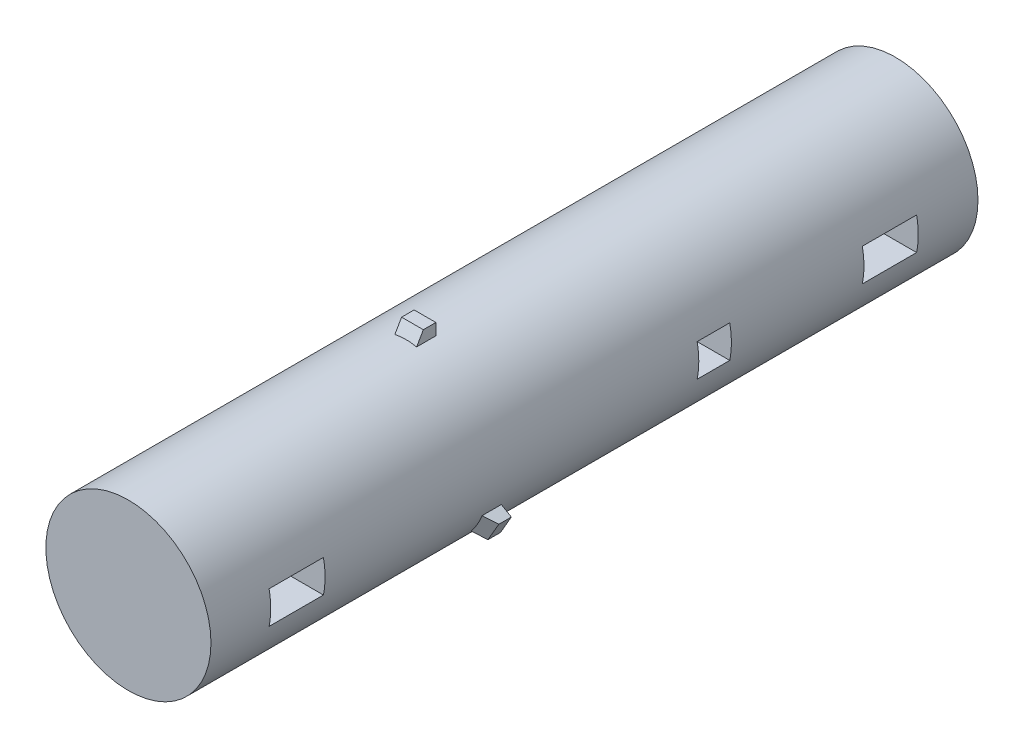
ISO-10303-21;
HEADER;
FILE_DESCRIPTION(('STEP AP214'),'2;1');
FILE_NAME('part.step','',(''),(''),'','','');
FILE_SCHEMA(('AUTOMOTIVE_DESIGN { 1 0 10303 214 1 1 1 1 }'));
ENDSEC;
DATA;
#1=APPLICATION_CONTEXT('core data for automotive mechanical design processes');
#2=APPLICATION_PROTOCOL_DEFINITION('international standard','automotive_design',2000,#1);
#3=PRODUCT_CONTEXT('',#1,'mechanical');
#4=PRODUCT('Part','Part','',(#3));
#5=PRODUCT_RELATED_PRODUCT_CATEGORY('part','',(#4));
#6=PRODUCT_DEFINITION_FORMATION('','',#4);
#7=PRODUCT_DEFINITION_CONTEXT('part definition',#1,'design');
#8=PRODUCT_DEFINITION('design','',#6,#7);
#9=PRODUCT_DEFINITION_SHAPE('','',#8);
#10=(LENGTH_UNIT() NAMED_UNIT(*) SI_UNIT(.MILLI.,.METRE.));
#11=(NAMED_UNIT(*) PLANE_ANGLE_UNIT() SI_UNIT($,.RADIAN.));
#12=(NAMED_UNIT(*) SI_UNIT($,.STERADIAN.) SOLID_ANGLE_UNIT());
#13=UNCERTAINTY_MEASURE_WITH_UNIT(LENGTH_MEASURE(1.E-05),#10,'distance_accuracy_value','');
#14=(GEOMETRIC_REPRESENTATION_CONTEXT(3) GLOBAL_UNCERTAINTY_ASSIGNED_CONTEXT((#13)) GLOBAL_UNIT_ASSIGNED_CONTEXT((#10,
#11,#12)) REPRESENTATION_CONTEXT('',''));
#15=CARTESIAN_POINT('',(0.,0.,0.));
#16=DIRECTION('',(0.,0.,1.));
#17=DIRECTION('',(1.,0.,0.));
#18=AXIS2_PLACEMENT_3D('',#15,#16,#17);
#19=CARTESIAN_POINT('',(0.,0.,35.3));
#20=DIRECTION('',(0.,0.,-1.));
#21=DIRECTION('',(-1.,0.,0.));
#22=AXIS2_PLACEMENT_3D('',#19,#20,#21);
#23=CYLINDRICAL_SURFACE('',#22,3.8);
#24=CARTESIAN_POINT('',(0.,0.,21.65));
#25=DIRECTION('',(0.,0.,1.));
#26=DIRECTION('',(1.,0.,0.));
#27=AXIS2_PLACEMENT_3D('',#24,#25,#26);
#28=CIRCLE('',#27,3.8);
#29=CARTESIAN_POINT('',(-3.51228447563974,-1.45046811829148,21.65));
#30=VERTEX_POINT('',#29);
#31=CARTESIAN_POINT('',(-3.01228447563975,-2.31649352207593,21.65));
#32=VERTEX_POINT('',#31);
#33=EDGE_CURVE('E46',#30,#32,#28,.T.);
#34=ORIENTED_EDGE('',*,*,#33,.F.);
#35=DIRECTION('',(0.,0.,-1.));
#36=VECTOR('',#35,1.);
#37=CARTESIAN_POINT('',(-3.51228447563974,-1.45046811829148,35.3));
#38=LINE('',#37,#36);
#39=CARTESIAN_POINT('',(-3.51228447563974,-1.45046811829148,22.5351001096119));
#40=VERTEX_POINT('',#39);
#41=EDGE_CURVE('E11',#30,#40,#38,.F.);
#42=ORIENTED_EDGE('',*,*,#41,.T.);
#43=CARTESIAN_POINT('',(0.,0.,24.709956426705));
#44=DIRECTION('',(-0.43301270189222,-0.249999999999995,0.86602540378444));
#45=DIRECTION('',(-0.750000000000005,-0.433012701892213,-0.499999999999998));
#46=AXIS2_PLACEMENT_3D('',#43,#44,#45);
#47=ELLIPSE('',#46,4.38786204584115,3.8);
#48=CARTESIAN_POINT('',(-3.01228447563975,-2.31649352207593,22.5351001096119));
#49=VERTEX_POINT('',#48);
#50=EDGE_CURVE('E383',#40,#49,#47,.T.);
#51=ORIENTED_EDGE('',*,*,#50,.T.);
#52=DIRECTION('',(0.,0.,-1.));
#53=VECTOR('',#52,1.);
#54=CARTESIAN_POINT('',(-3.01228447563975,-2.31649352207593,35.3));
#55=LINE('',#54,#53);
#56=EDGE_CURVE('E380',#32,#49,#55,.F.);
#57=ORIENTED_EDGE('',*,*,#56,.F.);
#58=EDGE_LOOP('',(#34,#42,#51,#57));
#59=FACE_BOUND('',#58,.T.);
#60=CARTESIAN_POINT('',(0.,0.,21.65));
#61=DIRECTION('',(0.,0.,1.));
#62=DIRECTION('',(1.,0.,0.));
#63=AXIS2_PLACEMENT_3D('',#60,#61,#62);
#64=CIRCLE('',#63,3.8);
#65=CARTESIAN_POINT('',(3.01228447563972,-2.31649352207597,21.65));
#66=VERTEX_POINT('',#65);
#67=CARTESIAN_POINT('',(3.51228447563973,-1.45046811829153,21.65));
#68=VERTEX_POINT('',#67);
#69=EDGE_CURVE('E375',#66,#68,#64,.T.);
#70=ORIENTED_EDGE('',*,*,#69,.F.);
#71=DIRECTION('',(0.,0.,-1.));
#72=VECTOR('',#71,1.);
#73=CARTESIAN_POINT('',(3.01228447563972,-2.31649352207597,35.3));
#74=LINE('',#73,#72);
#75=CARTESIAN_POINT('',(3.01228447563971,-2.31649352207596,22.5351001096119));
#76=VERTEX_POINT('',#75);
#77=EDGE_CURVE('E378',#66,#76,#74,.F.);
#78=ORIENTED_EDGE('',*,*,#77,.T.);
#79=CARTESIAN_POINT('',(0.,0.,24.709956426705));
#80=DIRECTION('',(0.433012701892216,-0.250000000000001,0.86602540378444));
#81=DIRECTION('',(0.749999999999999,-0.433012701892223,-0.499999999999998));
#82=AXIS2_PLACEMENT_3D('',#79,#80,#81);
#83=ELLIPSE('',#82,4.38786204584115,3.8);
#84=CARTESIAN_POINT('',(3.51228447563972,-1.45046811829153,22.5351001096119));
#85=VERTEX_POINT('',#84);
#86=EDGE_CURVE('E373',#76,#85,#83,.T.);
#87=ORIENTED_EDGE('',*,*,#86,.T.);
#88=DIRECTION('',(0.,0.,-1.));
#89=VECTOR('',#88,1.);
#90=CARTESIAN_POINT('',(3.51228447563973,-1.45046811829153,35.3));
#91=LINE('',#90,#89);
#92=EDGE_CURVE('E370',#68,#85,#91,.F.);
#93=ORIENTED_EDGE('',*,*,#92,.F.);
#94=EDGE_LOOP('',(#70,#78,#87,#93));
#95=FACE_BOUND('',#94,.T.);
#96=CARTESIAN_POINT('',(0.,0.,21.65));
#97=DIRECTION('',(0.,0.,1.));
#98=DIRECTION('',(1.,0.,0.));
#99=AXIS2_PLACEMENT_3D('',#96,#97,#98);
#100=CIRCLE('',#99,3.8);
#101=CARTESIAN_POINT('',(0.5,3.76696164036747,21.65));
#102=VERTEX_POINT('',#101);
#103=CARTESIAN_POINT('',(-0.5,3.76696164036747,21.65));
#104=VERTEX_POINT('',#103);
#105=EDGE_CURVE('E365',#102,#104,#100,.T.);
#106=ORIENTED_EDGE('',*,*,#105,.F.);
#107=DIRECTION('',(0.,0.,-1.));
#108=VECTOR('',#107,1.);
#109=CARTESIAN_POINT('',(0.5,3.76696164036747,35.3));
#110=LINE('',#109,#108);
#111=CARTESIAN_POINT('',(0.5,3.76696164036747,22.5351001096119));
#112=VERTEX_POINT('',#111);
#113=EDGE_CURVE('E368',#102,#112,#110,.F.);
#114=ORIENTED_EDGE('',*,*,#113,.T.);
#115=CARTESIAN_POINT('',(0.,0.,24.709956426705));
#116=DIRECTION('',(0.,0.499999999999998,0.86602540378444));
#117=DIRECTION('',(0.,0.86602540378444,-0.499999999999998));
#118=AXIS2_PLACEMENT_3D('',#115,#116,#117);
#119=ELLIPSE('',#118,4.38786204584115,3.8);
#120=CARTESIAN_POINT('',(-0.5,3.76696164036747,22.5351001096119));
#121=VERTEX_POINT('',#120);
#122=EDGE_CURVE('E363',#112,#121,#119,.T.);
#123=ORIENTED_EDGE('',*,*,#122,.T.);
#124=DIRECTION('',(0.,0.,-1.));
#125=VECTOR('',#124,1.);
#126=CARTESIAN_POINT('',(-0.5,3.76696164036747,35.3));
#127=LINE('',#126,#125);
#128=EDGE_CURVE('E360',#104,#121,#127,.F.);
#129=ORIENTED_EDGE('',*,*,#128,.F.);
#130=EDGE_LOOP('',(#106,#114,#123,#129));
#131=FACE_BOUND('',#130,.T.);
#132=CARTESIAN_POINT('',(0.,0.,12.85));
#133=DIRECTION('',(0.,0.,-1.));
#134=DIRECTION('',(-1.,0.,0.));
#135=AXIS2_PLACEMENT_3D('',#132,#133,#134);
#136=CIRCLE('',#135,3.8);
#137=CARTESIAN_POINT('',(3.72525166935068,0.75,12.85));
#138=VERTEX_POINT('',#137);
#139=CARTESIAN_POINT('',(3.72525166935068,-0.75,12.85));
#140=VERTEX_POINT('',#139);
#141=EDGE_CURVE('E344',#138,#140,#136,.T.);
#142=ORIENTED_EDGE('',*,*,#141,.F.);
#143=DIRECTION('',(0.,0.,-1.));
#144=VECTOR('',#143,1.);
#145=CARTESIAN_POINT('',(3.72525166935068,0.75,35.3));
#146=LINE('',#145,#144);
#147=CARTESIAN_POINT('',(3.72525166935068,0.75,11.35));
#148=VERTEX_POINT('',#147);
#149=EDGE_CURVE('E354',#148,#138,#146,.F.);
#150=ORIENTED_EDGE('',*,*,#149,.F.);
#151=CARTESIAN_POINT('',(0.,0.,11.35));
#152=DIRECTION('',(0.,0.,-1.));
#153=DIRECTION('',(-1.,0.,0.));
#154=AXIS2_PLACEMENT_3D('',#151,#152,#153);
#155=CIRCLE('',#154,3.8);
#156=CARTESIAN_POINT('',(3.72525166935068,-0.75,11.35));
#157=VERTEX_POINT('',#156);
#158=EDGE_CURVE('E341',#148,#157,#155,.T.);
#159=ORIENTED_EDGE('',*,*,#158,.T.);
#160=DIRECTION('',(0.,0.,-1.));
#161=VECTOR('',#160,1.);
#162=CARTESIAN_POINT('',(3.72525166935068,-0.75,35.3));
#163=LINE('',#162,#161);
#164=EDGE_CURVE('E347',#157,#140,#163,.F.);
#165=ORIENTED_EDGE('',*,*,#164,.T.);
#166=EDGE_LOOP('',(#142,#150,#159,#165));
#167=FACE_BOUND('',#166,.T.);
#168=CARTESIAN_POINT('',(0.,0.,5.25));
#169=DIRECTION('',(0.,0.,-1.));
#170=DIRECTION('',(-1.,0.,0.));
#171=AXIS2_PLACEMENT_3D('',#168,#169,#170);
#172=CIRCLE('',#171,3.8);
#173=CARTESIAN_POINT('',(3.72525166935068,0.75,5.25));
#174=VERTEX_POINT('',#173);
#175=CARTESIAN_POINT('',(3.72525166935068,-0.75,5.25));
#176=VERTEX_POINT('',#175);
#177=EDGE_CURVE('E326',#174,#176,#172,.T.);
#178=ORIENTED_EDGE('',*,*,#177,.F.);
#179=DIRECTION('',(0.,0.,-1.));
#180=VECTOR('',#179,1.);
#181=CARTESIAN_POINT('',(3.72525166935068,0.75,35.3));
#182=LINE('',#181,#180);
#183=CARTESIAN_POINT('',(3.72525166935068,0.75,2.75));
#184=VERTEX_POINT('',#183);
#185=EDGE_CURVE('E335',#174,#184,#182,.T.);
#186=ORIENTED_EDGE('',*,*,#185,.T.);
#187=CARTESIAN_POINT('',(0.,0.,2.75));
#188=DIRECTION('',(0.,0.,-1.));
#189=DIRECTION('',(-1.,0.,0.));
#190=AXIS2_PLACEMENT_3D('',#187,#188,#189);
#191=CIRCLE('',#190,3.8);
#192=CARTESIAN_POINT('',(3.72525166935068,-0.75,2.75));
#193=VERTEX_POINT('',#192);
#194=EDGE_CURVE('E323',#184,#193,#191,.T.);
#195=ORIENTED_EDGE('',*,*,#194,.T.);
#196=DIRECTION('',(0.,0.,-1.));
#197=VECTOR('',#196,1.);
#198=CARTESIAN_POINT('',(3.72525166935068,-0.75,35.3));
#199=LINE('',#198,#197);
#200=EDGE_CURVE('E329',#176,#193,#199,.T.);
#201=ORIENTED_EDGE('',*,*,#200,.F.);
#202=EDGE_LOOP('',(#178,#186,#195,#201));
#203=FACE_BOUND('',#202,.T.);
#204=CARTESIAN_POINT('',(0.,0.,32.55));
#205=DIRECTION('',(0.,0.,-1.));
#206=DIRECTION('',(-1.,0.,0.));
#207=AXIS2_PLACEMENT_3D('',#204,#205,#206);
#208=CIRCLE('',#207,3.8);
#209=CARTESIAN_POINT('',(3.72525166935068,0.75,32.55));
#210=VERTEX_POINT('',#209);
#211=CARTESIAN_POINT('',(3.72525166935068,-0.75,32.55));
#212=VERTEX_POINT('',#211);
#213=EDGE_CURVE('E307',#210,#212,#208,.T.);
#214=ORIENTED_EDGE('',*,*,#213,.F.);
#215=DIRECTION('',(0.,0.,-1.));
#216=VECTOR('',#215,1.);
#217=CARTESIAN_POINT('',(3.72525166935068,0.75,35.3));
#218=LINE('',#217,#216);
#219=CARTESIAN_POINT('',(3.72525166935068,0.75,30.05));
#220=VERTEX_POINT('',#219);
#221=EDGE_CURVE('E317',#220,#210,#218,.F.);
#222=ORIENTED_EDGE('',*,*,#221,.F.);
#223=CARTESIAN_POINT('',(0.,0.,30.05));
#224=DIRECTION('',(0.,0.,-1.));
#225=DIRECTION('',(-1.,0.,0.));
#226=AXIS2_PLACEMENT_3D('',#223,#224,#225);
#227=CIRCLE('',#226,3.8);
#228=CARTESIAN_POINT('',(3.72525166935068,-0.75,30.05));
#229=VERTEX_POINT('',#228);
#230=EDGE_CURVE('E302',#220,#229,#227,.T.);
#231=ORIENTED_EDGE('',*,*,#230,.T.);
#232=DIRECTION('',(0.,0.,-1.));
#233=VECTOR('',#232,1.);
#234=CARTESIAN_POINT('',(3.72525166935068,-0.75,35.3));
#235=LINE('',#234,#233);
#236=EDGE_CURVE('E310',#229,#212,#235,.F.);
#237=ORIENTED_EDGE('',*,*,#236,.T.);
#238=EDGE_LOOP('',(#214,#222,#231,#237));
#239=FACE_BOUND('',#238,.T.);
#240=CARTESIAN_POINT('',(0.,0.,35.3));
#241=DIRECTION('',(0.,0.,1.));
#242=DIRECTION('',(1.,0.,0.));
#243=AXIS2_PLACEMENT_3D('',#240,#241,#242);
#244=CIRCLE('',#243,3.8);
#245=CARTESIAN_POINT('',(3.8,0.,35.3));
#246=VERTEX_POINT('',#245);
#247=EDGE_CURVE('E299',#246,#246,#244,.T.);
#248=ORIENTED_EDGE('',*,*,#247,.F.);
#249=EDGE_LOOP('',(#248));
#250=FACE_BOUND('',#249,.T.);
#251=CARTESIAN_POINT('',(0.,0.,0.));
#252=DIRECTION('',(0.,0.,1.));
#253=DIRECTION('',(1.,0.,0.));
#254=AXIS2_PLACEMENT_3D('',#251,#252,#253);
#255=CIRCLE('',#254,3.8);
#256=CARTESIAN_POINT('',(3.8,0.,0.));
#257=VERTEX_POINT('',#256);
#258=EDGE_CURVE('E291',#257,#257,#255,.T.);
#259=ORIENTED_EDGE('',*,*,#258,.T.);
#260=EDGE_LOOP('',(#259));
#261=FACE_BOUND('',#260,.T.);
#262=DIRECTION('',(0.,0.,-1.));
#263=VECTOR('',#262,1.);
#264=CARTESIAN_POINT('',(-3.72525166935068,0.75,35.3));
#265=LINE('',#264,#263);
#266=CARTESIAN_POINT('',(-3.72525166935068,0.75,32.55));
#267=VERTEX_POINT('',#266);
#268=CARTESIAN_POINT('',(-3.72525166935068,0.75,30.05));
#269=VERTEX_POINT('',#268);
#270=EDGE_CURVE('E320',#267,#269,#265,.T.);
#271=ORIENTED_EDGE('',*,*,#270,.F.);
#272=CARTESIAN_POINT('',(-3.72525166935068,-0.75,32.55));
#273=VERTEX_POINT('',#272);
#274=EDGE_CURVE('E311',#273,#267,#208,.T.);
#275=ORIENTED_EDGE('',*,*,#274,.F.);
#276=DIRECTION('',(0.,0.,-1.));
#277=VECTOR('',#276,1.);
#278=CARTESIAN_POINT('',(-3.72525166935068,-0.75,35.3));
#279=LINE('',#278,#277);
#280=CARTESIAN_POINT('',(-3.72525166935068,-0.75,30.05));
#281=VERTEX_POINT('',#280);
#282=EDGE_CURVE('E314',#273,#281,#279,.T.);
#283=ORIENTED_EDGE('',*,*,#282,.T.);
#284=EDGE_CURVE('E308',#281,#269,#227,.T.);
#285=ORIENTED_EDGE('',*,*,#284,.T.);
#286=EDGE_LOOP('',(#271,#275,#283,#285));
#287=FACE_BOUND('',#286,.T.);
#288=DIRECTION('',(0.,0.,-1.));
#289=VECTOR('',#288,1.);
#290=CARTESIAN_POINT('',(-3.72525166935068,0.75,35.3));
#291=LINE('',#290,#289);
#292=CARTESIAN_POINT('',(-3.72525166935068,0.75,2.75));
#293=VERTEX_POINT('',#292);
#294=CARTESIAN_POINT('',(-3.72525166935068,0.75,5.25));
#295=VERTEX_POINT('',#294);
#296=EDGE_CURVE('E338',#293,#295,#291,.F.);
#297=ORIENTED_EDGE('',*,*,#296,.T.);
#298=CARTESIAN_POINT('',(-3.72525166935068,-0.75,5.25));
#299=VERTEX_POINT('',#298);
#300=EDGE_CURVE('E330',#299,#295,#172,.T.);
#301=ORIENTED_EDGE('',*,*,#300,.F.);
#302=DIRECTION('',(0.,0.,-1.));
#303=VECTOR('',#302,1.);
#304=CARTESIAN_POINT('',(-3.72525166935068,-0.75,35.3));
#305=LINE('',#304,#303);
#306=CARTESIAN_POINT('',(-3.72525166935068,-0.75,2.75));
#307=VERTEX_POINT('',#306);
#308=EDGE_CURVE('E333',#307,#299,#305,.F.);
#309=ORIENTED_EDGE('',*,*,#308,.F.);
#310=EDGE_CURVE('E327',#307,#293,#191,.T.);
#311=ORIENTED_EDGE('',*,*,#310,.T.);
#312=EDGE_LOOP('',(#297,#301,#309,#311));
#313=FACE_BOUND('',#312,.T.);
#314=DIRECTION('',(0.,0.,-1.));
#315=VECTOR('',#314,1.);
#316=CARTESIAN_POINT('',(-3.72525166935068,0.75,35.3));
#317=LINE('',#316,#315);
#318=CARTESIAN_POINT('',(-3.72525166935068,0.75,12.85));
#319=VERTEX_POINT('',#318);
#320=CARTESIAN_POINT('',(-3.72525166935068,0.75,11.35));
#321=VERTEX_POINT('',#320);
#322=EDGE_CURVE('E357',#319,#321,#317,.T.);
#323=ORIENTED_EDGE('',*,*,#322,.F.);
#324=CARTESIAN_POINT('',(-3.72525166935068,-0.75,12.85));
#325=VERTEX_POINT('',#324);
#326=EDGE_CURVE('E348',#325,#319,#136,.T.);
#327=ORIENTED_EDGE('',*,*,#326,.F.);
#328=DIRECTION('',(0.,0.,-1.));
#329=VECTOR('',#328,1.);
#330=CARTESIAN_POINT('',(-3.72525166935068,-0.75,35.3));
#331=LINE('',#330,#329);
#332=CARTESIAN_POINT('',(-3.72525166935068,-0.75,11.35));
#333=VERTEX_POINT('',#332);
#334=EDGE_CURVE('E351',#325,#333,#331,.T.);
#335=ORIENTED_EDGE('',*,*,#334,.T.);
#336=EDGE_CURVE('E345',#333,#321,#155,.T.);
#337=ORIENTED_EDGE('',*,*,#336,.T.);
#338=EDGE_LOOP('',(#323,#327,#335,#337));
#339=FACE_BOUND('',#338,.T.);
#340=ADVANCED_FACE('F39',(#59,#95,#131,#167,#203,#239,#250,#261,#287,#313,#339),#23,.T.);
#341=CARTESIAN_POINT('',(0.,0.,35.3));
#342=DIRECTION('',(0.,0.,1.));
#343=DIRECTION('',(1.,0.,0.));
#344=AXIS2_PLACEMENT_3D('',#341,#342,#343);
#345=PLANE('',#344);
#346=ORIENTED_EDGE('',*,*,#247,.T.);
#347=EDGE_LOOP('',(#346));
#348=FACE_BOUND('',#347,.T.);
#349=ADVANCED_FACE('F391',(#348),#345,.T.);
#350=CARTESIAN_POINT('',(0.,0.,0.));
#351=DIRECTION('',(0.,0.,1.));
#352=DIRECTION('',(1.,0.,0.));
#353=AXIS2_PLACEMENT_3D('',#350,#351,#352);
#354=PLANE('',#353);
#355=ORIENTED_EDGE('',*,*,#258,.F.);
#356=EDGE_LOOP('',(#355));
#357=FACE_BOUND('',#356,.T.);
#358=ADVANCED_FACE('F468',(#357),#354,.F.);
#359=CARTESIAN_POINT('',(-3.8,-0.75,0.));
#360=DIRECTION('',(0.,-1.,0.));
#361=DIRECTION('',(0.,0.,-1.));
#362=AXIS2_PLACEMENT_3D('',#359,#360,#361);
#363=PLANE('',#362);
#364=DIRECTION('',(1.,0.,0.));
#365=VECTOR('',#364,1.);
#366=CARTESIAN_POINT('',(-3.8,-0.75,32.55));
#367=LINE('',#366,#365);
#368=EDGE_CURVE('E288',#273,#212,#367,.T.);
#369=ORIENTED_EDGE('',*,*,#368,.T.);
#370=ORIENTED_EDGE('',*,*,#236,.F.);
#371=DIRECTION('',(1.,0.,0.));
#372=VECTOR('',#371,1.);
#373=CARTESIAN_POINT('',(-3.8,-0.75,30.05));
#374=LINE('',#373,#372);
#375=EDGE_CURVE('E280',#281,#229,#374,.T.);
#376=ORIENTED_EDGE('',*,*,#375,.F.);
#377=ORIENTED_EDGE('',*,*,#282,.F.);
#378=EDGE_LOOP('',(#369,#370,#376,#377));
#379=FACE_BOUND('',#378,.T.);
#380=ADVANCED_FACE('F458',(#379),#363,.F.);
#381=CARTESIAN_POINT('',(-3.8,0.,32.55));
#382=DIRECTION('',(0.,0.,-1.));
#383=DIRECTION('',(-1.,0.,0.));
#384=AXIS2_PLACEMENT_3D('',#381,#382,#383);
#385=PLANE('',#384);
#386=DIRECTION('',(1.,0.,0.));
#387=VECTOR('',#386,1.);
#388=CARTESIAN_POINT('',(-3.8,0.75,32.55));
#389=LINE('',#388,#387);
#390=EDGE_CURVE('E292',#267,#210,#389,.T.);
#391=ORIENTED_EDGE('',*,*,#390,.T.);
#392=ORIENTED_EDGE('',*,*,#213,.T.);
#393=ORIENTED_EDGE('',*,*,#368,.F.);
#394=ORIENTED_EDGE('',*,*,#274,.T.);
#395=EDGE_LOOP('',(#391,#392,#393,#394));
#396=FACE_BOUND('',#395,.T.);
#397=ADVANCED_FACE('F454',(#396),#385,.T.);
#398=CARTESIAN_POINT('',(-3.8,0.75,0.));
#399=DIRECTION('',(0.,-1.,0.));
#400=DIRECTION('',(0.,0.,-1.));
#401=AXIS2_PLACEMENT_3D('',#398,#399,#400);
#402=PLANE('',#401);
#403=ORIENTED_EDGE('',*,*,#270,.T.);
#404=DIRECTION('',(1.,0.,0.));
#405=VECTOR('',#404,1.);
#406=CARTESIAN_POINT('',(-3.8,0.75,30.05));
#407=LINE('',#406,#405);
#408=EDGE_CURVE('E295',#269,#220,#407,.T.);
#409=ORIENTED_EDGE('',*,*,#408,.T.);
#410=ORIENTED_EDGE('',*,*,#221,.T.);
#411=ORIENTED_EDGE('',*,*,#390,.F.);
#412=EDGE_LOOP('',(#403,#409,#410,#411));
#413=FACE_BOUND('',#412,.T.);
#414=ADVANCED_FACE('F457',(#413),#402,.T.);
#415=CARTESIAN_POINT('',(-3.8,0.,30.05));
#416=DIRECTION('',(0.,0.,-1.));
#417=DIRECTION('',(-1.,0.,0.));
#418=AXIS2_PLACEMENT_3D('',#415,#416,#417);
#419=PLANE('',#418);
#420=ORIENTED_EDGE('',*,*,#408,.F.);
#421=ORIENTED_EDGE('',*,*,#284,.F.);
#422=ORIENTED_EDGE('',*,*,#375,.T.);
#423=ORIENTED_EDGE('',*,*,#230,.F.);
#424=EDGE_LOOP('',(#420,#421,#422,#423));
#425=FACE_BOUND('',#424,.T.);
#426=ADVANCED_FACE('F452',(#425),#419,.F.);
#427=CARTESIAN_POINT('',(-3.8,-0.75,35.3));
#428=DIRECTION('',(0.,1.,0.));
#429=DIRECTION('',(0.,0.,1.));
#430=AXIS2_PLACEMENT_3D('',#427,#428,#429);
#431=PLANE('',#430);
#432=ORIENTED_EDGE('',*,*,#200,.T.);
#433=DIRECTION('',(1.,0.,0.));
#434=VECTOR('',#433,1.);
#435=CARTESIAN_POINT('',(-3.8,-0.75,2.75));
#436=LINE('',#435,#434);
#437=EDGE_CURVE('E269',#307,#193,#436,.T.);
#438=ORIENTED_EDGE('',*,*,#437,.F.);
#439=ORIENTED_EDGE('',*,*,#308,.T.);
#440=DIRECTION('',(1.,0.,0.));
#441=VECTOR('',#440,1.);
#442=CARTESIAN_POINT('',(-3.8,-0.75,5.25));
#443=LINE('',#442,#441);
#444=EDGE_CURVE('E277',#299,#176,#443,.T.);
#445=ORIENTED_EDGE('',*,*,#444,.T.);
#446=EDGE_LOOP('',(#432,#438,#439,#445));
#447=FACE_BOUND('',#446,.T.);
#448=ADVANCED_FACE('F445',(#447),#431,.T.);
#449=CARTESIAN_POINT('',(-3.8,0.,5.25));
#450=DIRECTION('',(0.,0.,-1.));
#451=DIRECTION('',(-1.,0.,0.));
#452=AXIS2_PLACEMENT_3D('',#449,#450,#451);
#453=PLANE('',#452);
#454=DIRECTION('',(1.,0.,0.));
#455=VECTOR('',#454,1.);
#456=CARTESIAN_POINT('',(-3.8,0.75,5.25));
#457=LINE('',#456,#455);
#458=EDGE_CURVE('E281',#295,#174,#457,.T.);
#459=ORIENTED_EDGE('',*,*,#458,.T.);
#460=ORIENTED_EDGE('',*,*,#177,.T.);
#461=ORIENTED_EDGE('',*,*,#444,.F.);
#462=ORIENTED_EDGE('',*,*,#300,.T.);
#463=EDGE_LOOP('',(#459,#460,#461,#462));
#464=FACE_BOUND('',#463,.T.);
#465=ADVANCED_FACE('F442',(#464),#453,.T.);
#466=CARTESIAN_POINT('',(-3.8,0.75,35.3));
#467=DIRECTION('',(0.,1.,0.));
#468=DIRECTION('',(0.,0.,1.));
#469=AXIS2_PLACEMENT_3D('',#466,#467,#468);
#470=PLANE('',#469);
#471=ORIENTED_EDGE('',*,*,#458,.F.);
#472=ORIENTED_EDGE('',*,*,#296,.F.);
#473=DIRECTION('',(1.,0.,0.));
#474=VECTOR('',#473,1.);
#475=CARTESIAN_POINT('',(-3.8,0.75,2.75));
#476=LINE('',#475,#474);
#477=EDGE_CURVE('E284',#293,#184,#476,.T.);
#478=ORIENTED_EDGE('',*,*,#477,.T.);
#479=ORIENTED_EDGE('',*,*,#185,.F.);
#480=EDGE_LOOP('',(#471,#472,#478,#479));
#481=FACE_BOUND('',#480,.T.);
#482=ADVANCED_FACE('F436',(#481),#470,.F.);
#483=CARTESIAN_POINT('',(-3.8,0.,2.75));
#484=DIRECTION('',(0.,0.,-1.));
#485=DIRECTION('',(-1.,0.,0.));
#486=AXIS2_PLACEMENT_3D('',#483,#484,#485);
#487=PLANE('',#486);
#488=ORIENTED_EDGE('',*,*,#477,.F.);
#489=ORIENTED_EDGE('',*,*,#310,.F.);
#490=ORIENTED_EDGE('',*,*,#437,.T.);
#491=ORIENTED_EDGE('',*,*,#194,.F.);
#492=EDGE_LOOP('',(#488,#489,#490,#491));
#493=FACE_BOUND('',#492,.T.);
#494=ADVANCED_FACE('F429',(#493),#487,.F.);
#495=CARTESIAN_POINT('',(-3.8,-0.75,12.85));
#496=DIRECTION('',(0.,-1.,0.));
#497=DIRECTION('',(0.,0.,-1.));
#498=AXIS2_PLACEMENT_3D('',#495,#496,#497);
#499=PLANE('',#498);
#500=DIRECTION('',(1.,0.,0.));
#501=VECTOR('',#500,1.);
#502=CARTESIAN_POINT('',(-3.8,-0.75,12.85));
#503=LINE('',#502,#501);
#504=EDGE_CURVE('E266',#325,#140,#503,.T.);
#505=ORIENTED_EDGE('',*,*,#504,.T.);
#506=ORIENTED_EDGE('',*,*,#164,.F.);
#507=DIRECTION('',(1.,0.,0.));
#508=VECTOR('',#507,1.);
#509=CARTESIAN_POINT('',(-3.8,-0.75,11.35));
#510=LINE('',#509,#508);
#511=EDGE_CURVE('E265',#333,#157,#510,.T.);
#512=ORIENTED_EDGE('',*,*,#511,.F.);
#513=ORIENTED_EDGE('',*,*,#334,.F.);
#514=EDGE_LOOP('',(#505,#506,#512,#513));
#515=FACE_BOUND('',#514,.T.);
#516=ADVANCED_FACE('F427',(#515),#499,.F.);
#517=CARTESIAN_POINT('',(-3.8,-0.75,12.85));
#518=DIRECTION('',(0.,0.,-1.));
#519=DIRECTION('',(-1.,0.,0.));
#520=AXIS2_PLACEMENT_3D('',#517,#518,#519);
#521=PLANE('',#520);
#522=DIRECTION('',(1.,0.,0.));
#523=VECTOR('',#522,1.);
#524=CARTESIAN_POINT('',(-3.8,0.75,12.85));
#525=LINE('',#524,#523);
#526=EDGE_CURVE('E270',#319,#138,#525,.T.);
#527=ORIENTED_EDGE('',*,*,#526,.T.);
#528=ORIENTED_EDGE('',*,*,#141,.T.);
#529=ORIENTED_EDGE('',*,*,#504,.F.);
#530=ORIENTED_EDGE('',*,*,#326,.T.);
#531=EDGE_LOOP('',(#527,#528,#529,#530));
#532=FACE_BOUND('',#531,.T.);
#533=ADVANCED_FACE('F424',(#532),#521,.T.);
#534=CARTESIAN_POINT('',(-3.8,0.75,12.85));
#535=DIRECTION('',(0.,-1.,0.));
#536=DIRECTION('',(0.,0.,-1.));
#537=AXIS2_PLACEMENT_3D('',#534,#535,#536);
#538=PLANE('',#537);
#539=ORIENTED_EDGE('',*,*,#322,.T.);
#540=DIRECTION('',(1.,0.,0.));
#541=VECTOR('',#540,1.);
#542=CARTESIAN_POINT('',(-3.8,0.75,11.35));
#543=LINE('',#542,#541);
#544=EDGE_CURVE('E273',#321,#148,#543,.T.);
#545=ORIENTED_EDGE('',*,*,#544,.T.);
#546=ORIENTED_EDGE('',*,*,#149,.T.);
#547=ORIENTED_EDGE('',*,*,#526,.F.);
#548=EDGE_LOOP('',(#539,#545,#546,#547));
#549=FACE_BOUND('',#548,.T.);
#550=ADVANCED_FACE('F418',(#549),#538,.T.);
#551=CARTESIAN_POINT('',(-3.8,-0.75,11.35));
#552=DIRECTION('',(0.,0.,-1.));
#553=DIRECTION('',(-1.,0.,0.));
#554=AXIS2_PLACEMENT_3D('',#551,#552,#553);
#555=PLANE('',#554);
#556=ORIENTED_EDGE('',*,*,#544,.F.);
#557=ORIENTED_EDGE('',*,*,#336,.F.);
#558=ORIENTED_EDGE('',*,*,#511,.T.);
#559=ORIENTED_EDGE('',*,*,#158,.F.);
#560=EDGE_LOOP('',(#556,#557,#558,#559));
#561=FACE_BOUND('',#560,.T.);
#562=ADVANCED_FACE('F420',(#561),#555,.F.);
#563=CARTESIAN_POINT('',(0.5,0.,0.));
#564=DIRECTION('',(1.,0.,0.));
#565=DIRECTION('',(0.,0.,-1.));
#566=AXIS2_PLACEMENT_3D('',#563,#564,#565);
#567=PLANE('',#566);
#568=ORIENTED_EDGE('',*,*,#113,.F.);
#569=DIRECTION('',(0.,1.,0.));
#570=VECTOR('',#569,1.);
#571=CARTESIAN_POINT('',(0.5,0.,21.65));
#572=LINE('',#571,#570);
#573=CARTESIAN_POINT('',(0.5,4.3,21.65));
#574=VERTEX_POINT('',#573);
#575=EDGE_CURVE('E246',#102,#574,#572,.T.);
#576=ORIENTED_EDGE('',*,*,#575,.T.);
#577=DIRECTION('',(0.,0.,-1.));
#578=VECTOR('',#577,1.);
#579=CARTESIAN_POINT('',(0.5,4.3,0.));
#580=LINE('',#579,#578);
#581=CARTESIAN_POINT('',(0.5,4.3,22.2273502691896));
#582=VERTEX_POINT('',#581);
#583=EDGE_CURVE('E248',#582,#574,#580,.T.);
#584=ORIENTED_EDGE('',*,*,#583,.F.);
#585=DIRECTION('',(0.,0.86602540378444,-0.499999999999998));
#586=VECTOR('',#585,1.);
#587=CARTESIAN_POINT('',(0.5,10.6997249959665,18.5324673200288));
#588=LINE('',#587,#586);
#589=EDGE_CURVE('E252',#112,#582,#588,.T.);
#590=ORIENTED_EDGE('',*,*,#589,.F.);
#591=EDGE_LOOP('',(#568,#576,#584,#590));
#592=FACE_BOUND('',#591,.T.);
#593=ADVANCED_FACE('F541',(#592),#567,.T.);
#594=CARTESIAN_POINT('',(-0.5,0.,0.));
#595=DIRECTION('',(1.,0.,0.));
#596=DIRECTION('',(0.,0.,-1.));
#597=AXIS2_PLACEMENT_3D('',#594,#595,#596);
#598=PLANE('',#597);
#599=DIRECTION('',(0.,1.,0.));
#600=VECTOR('',#599,1.);
#601=CARTESIAN_POINT('',(-0.5,0.,21.65));
#602=LINE('',#601,#600);
#603=CARTESIAN_POINT('',(-0.5,4.3,21.65));
#604=VERTEX_POINT('',#603);
#605=EDGE_CURVE('E245',#104,#604,#602,.T.);
#606=ORIENTED_EDGE('',*,*,#605,.F.);
#607=ORIENTED_EDGE('',*,*,#128,.T.);
#608=DIRECTION('',(0.,0.86602540378444,-0.499999999999998));
#609=VECTOR('',#608,1.);
#610=CARTESIAN_POINT('',(-0.5,10.6997249959665,18.5324673200288));
#611=LINE('',#610,#609);
#612=CARTESIAN_POINT('',(-0.5,4.3,22.2273502691896));
#613=VERTEX_POINT('',#612);
#614=EDGE_CURVE('E249',#121,#613,#611,.T.);
#615=ORIENTED_EDGE('',*,*,#614,.T.);
#616=DIRECTION('',(0.,0.,-1.));
#617=VECTOR('',#616,1.);
#618=CARTESIAN_POINT('',(-0.5,4.3,0.));
#619=LINE('',#618,#617);
#620=EDGE_CURVE('E256',#613,#604,#619,.T.);
#621=ORIENTED_EDGE('',*,*,#620,.T.);
#622=EDGE_LOOP('',(#606,#607,#615,#621));
#623=FACE_BOUND('',#622,.T.);
#624=ADVANCED_FACE('F551',(#623),#598,.F.);
#625=CARTESIAN_POINT('',(0.5,0.,21.65));
#626=DIRECTION('',(0.,0.,1.));
#627=DIRECTION('',(1.,0.,0.));
#628=AXIS2_PLACEMENT_3D('',#625,#626,#627);
#629=PLANE('',#628);
#630=ORIENTED_EDGE('',*,*,#575,.F.);
#631=ORIENTED_EDGE('',*,*,#105,.T.);
#632=ORIENTED_EDGE('',*,*,#605,.T.);
#633=DIRECTION('',(-1.,0.,0.));
#634=VECTOR('',#633,1.);
#635=CARTESIAN_POINT('',(0.5,4.3,21.65));
#636=LINE('',#635,#634);
#637=EDGE_CURVE('E262',#574,#604,#636,.T.);
#638=ORIENTED_EDGE('',*,*,#637,.F.);
#639=EDGE_LOOP('',(#630,#631,#632,#638));
#640=FACE_BOUND('',#639,.T.);
#641=ADVANCED_FACE('F562',(#640),#629,.F.);
#642=CARTESIAN_POINT('',(0.5,4.3,0.));
#643=DIRECTION('',(0.,1.,0.));
#644=DIRECTION('',(0.,0.,1.));
#645=AXIS2_PLACEMENT_3D('',#642,#643,#644);
#646=PLANE('',#645);
#647=ORIENTED_EDGE('',*,*,#620,.F.);
#648=DIRECTION('',(-1.,0.,0.));
#649=VECTOR('',#648,1.);
#650=CARTESIAN_POINT('',(0.5,4.3,22.2273502691896));
#651=LINE('',#650,#649);
#652=EDGE_CURVE('E254',#582,#613,#651,.T.);
#653=ORIENTED_EDGE('',*,*,#652,.F.);
#654=ORIENTED_EDGE('',*,*,#583,.T.);
#655=ORIENTED_EDGE('',*,*,#637,.T.);
#656=EDGE_LOOP('',(#647,#653,#654,#655));
#657=FACE_BOUND('',#656,.T.);
#658=ADVANCED_FACE('F572',(#657),#646,.T.);
#659=CARTESIAN_POINT('',(0.5,10.6997249959665,18.5324673200288));
#660=DIRECTION('',(0.,0.499999999999998,0.86602540378444));
#661=DIRECTION('',(0.,-0.86602540378444,0.499999999999998));
#662=AXIS2_PLACEMENT_3D('',#659,#660,#661);
#663=PLANE('',#662);
#664=ORIENTED_EDGE('',*,*,#122,.F.);
#665=ORIENTED_EDGE('',*,*,#589,.T.);
#666=ORIENTED_EDGE('',*,*,#652,.T.);
#667=ORIENTED_EDGE('',*,*,#614,.F.);
#668=EDGE_LOOP('',(#664,#665,#666,#667));
#669=FACE_BOUND('',#668,.T.);
#670=ADVANCED_FACE('F583',(#669),#663,.T.);
#671=CARTESIAN_POINT('',(-0.250000000000002,-0.433012701892218,0.));
#672=DIRECTION('',(-0.500000000000004,-0.866025403784436,0.));
#673=DIRECTION('',(0.,0.,-1.));
#674=AXIS2_PLACEMENT_3D('',#671,#672,#673);
#675=PLANE('',#674);
#676=ORIENTED_EDGE('',*,*,#77,.F.);
#677=DIRECTION('',(0.866025403784436,-0.500000000000004,0.));
#678=VECTOR('',#677,1.);
#679=CARTESIAN_POINT('',(-0.250000000000002,-0.433012701892218,21.65));
#680=LINE('',#679,#678);
#681=CARTESIAN_POINT('',(3.47390923627307,-2.58301270189224,21.65));
#682=VERTEX_POINT('',#681);
#683=EDGE_CURVE('E226',#66,#682,#680,.T.);
#684=ORIENTED_EDGE('',*,*,#683,.T.);
#685=DIRECTION('',(0.,0.,-1.));
#686=VECTOR('',#685,1.);
#687=CARTESIAN_POINT('',(3.47390923627307,-2.58301270189224,0.));
#688=LINE('',#687,#686);
#689=CARTESIAN_POINT('',(3.47390923627307,-2.58301270189224,22.2273502691896));
#690=VERTEX_POINT('',#689);
#691=EDGE_CURVE('E228',#690,#682,#688,.T.);
#692=ORIENTED_EDGE('',*,*,#691,.F.);
#693=DIRECTION('',(0.749999999999999,-0.433012701892224,-0.499999999999998));
#694=VECTOR('',#693,1.);
#695=CARTESIAN_POINT('',(9.01623366001432,-5.78287519987552,18.5324673200288));
#696=LINE('',#695,#694);
#697=EDGE_CURVE('E232',#76,#690,#696,.T.);
#698=ORIENTED_EDGE('',*,*,#697,.F.);
#699=EDGE_LOOP('',(#676,#684,#692,#698));
#700=FACE_BOUND('',#699,.T.);
#701=ADVANCED_FACE('F594',(#700),#675,.T.);
#702=CARTESIAN_POINT('',(0.250000000000002,0.433012701892218,0.));
#703=DIRECTION('',(-0.500000000000004,-0.866025403784436,0.));
#704=DIRECTION('',(0.,0.,-1.));
#705=AXIS2_PLACEMENT_3D('',#702,#703,#704);
#706=PLANE('',#705);
#707=DIRECTION('',(0.866025403784436,-0.500000000000004,0.));
#708=VECTOR('',#707,1.);
#709=CARTESIAN_POINT('',(0.250000000000002,0.433012701892218,21.65));
#710=LINE('',#709,#708);
#711=CARTESIAN_POINT('',(3.97390923627308,-1.7169872981078,21.65));
#712=VERTEX_POINT('',#711);
#713=EDGE_CURVE('E211',#68,#712,#710,.T.);
#714=ORIENTED_EDGE('',*,*,#713,.F.);
#715=ORIENTED_EDGE('',*,*,#92,.T.);
#716=DIRECTION('',(0.749999999999999,-0.433012701892224,-0.499999999999998));
#717=VECTOR('',#716,1.);
#718=CARTESIAN_POINT('',(9.51623366001433,-4.91684979609108,18.5324673200288));
#719=LINE('',#718,#717);
#720=CARTESIAN_POINT('',(3.97390923627308,-1.7169872981078,22.2273502691896));
#721=VERTEX_POINT('',#720);
#722=EDGE_CURVE('E229',#85,#721,#719,.T.);
#723=ORIENTED_EDGE('',*,*,#722,.T.);
#724=DIRECTION('',(0.,0.,-1.));
#725=VECTOR('',#724,1.);
#726=CARTESIAN_POINT('',(3.97390923627308,-1.7169872981078,0.));
#727=LINE('',#726,#725);
#728=EDGE_CURVE('E236',#721,#712,#727,.T.);
#729=ORIENTED_EDGE('',*,*,#728,.T.);
#730=EDGE_LOOP('',(#714,#715,#723,#729));
#731=FACE_BOUND('',#730,.T.);
#732=ADVANCED_FACE('F612',(#731),#706,.F.);
#733=CARTESIAN_POINT('',(-0.250000000000002,-0.433012701892218,21.65));
#734=DIRECTION('',(0.,0.,1.));
#735=DIRECTION('',(1.,0.,0.));
#736=AXIS2_PLACEMENT_3D('',#733,#734,#735);
#737=PLANE('',#736);
#738=ORIENTED_EDGE('',*,*,#683,.F.);
#739=ORIENTED_EDGE('',*,*,#69,.T.);
#740=ORIENTED_EDGE('',*,*,#713,.T.);
#741=DIRECTION('',(0.500000000000004,0.866025403784436,0.));
#742=VECTOR('',#741,1.);
#743=CARTESIAN_POINT('',(3.47390923627307,-2.58301270189224,21.65));
#744=LINE('',#743,#742);
#745=EDGE_CURVE('E242',#682,#712,#744,.T.);
#746=ORIENTED_EDGE('',*,*,#745,.F.);
#747=EDGE_LOOP('',(#738,#739,#740,#746));
#748=FACE_BOUND('',#747,.T.);
#749=ADVANCED_FACE('F623',(#748),#737,.F.);
#750=CARTESIAN_POINT('',(3.47390923627307,-2.58301270189224,0.));
#751=DIRECTION('',(0.866025403784436,-0.500000000000004,0.));
#752=DIRECTION('',(0.500000000000004,0.866025403784436,0.));
#753=AXIS2_PLACEMENT_3D('',#750,#751,#752);
#754=PLANE('',#753);
#755=ORIENTED_EDGE('',*,*,#728,.F.);
#756=DIRECTION('',(0.500000000000004,0.866025403784436,0.));
#757=VECTOR('',#756,1.);
#758=CARTESIAN_POINT('',(3.47390923627307,-2.58301270189224,22.2273502691896));
#759=LINE('',#758,#757);
#760=EDGE_CURVE('E234',#690,#721,#759,.T.);
#761=ORIENTED_EDGE('',*,*,#760,.F.);
#762=ORIENTED_EDGE('',*,*,#691,.T.);
#763=ORIENTED_EDGE('',*,*,#745,.T.);
#764=EDGE_LOOP('',(#755,#761,#762,#763));
#765=FACE_BOUND('',#764,.T.);
#766=ADVANCED_FACE('F633',(#765),#754,.T.);
#767=CARTESIAN_POINT('',(9.01623366001432,-5.78287519987552,18.5324673200288));
#768=DIRECTION('',(0.433012701892216,-0.250000000000001,0.86602540378444));
#769=DIRECTION('',(0.894427190999917,0.,-0.447213595499955));
#770=AXIS2_PLACEMENT_3D('',#767,#768,#769);
#771=PLANE('',#770);
#772=ORIENTED_EDGE('',*,*,#86,.F.);
#773=ORIENTED_EDGE('',*,*,#697,.T.);
#774=ORIENTED_EDGE('',*,*,#760,.T.);
#775=ORIENTED_EDGE('',*,*,#722,.F.);
#776=EDGE_LOOP('',(#772,#773,#774,#775));
#777=FACE_BOUND('',#776,.T.);
#778=ADVANCED_FACE('F644',(#777),#771,.T.);
#779=CARTESIAN_POINT('',(-0.249999999999996,0.433012701892222,0.));
#780=DIRECTION('',(-0.499999999999992,0.866025403784443,0.));
#781=DIRECTION('',(0.,0.,-1.));
#782=AXIS2_PLACEMENT_3D('',#779,#780,#781);
#783=PLANE('',#782);
#784=ORIENTED_EDGE('',*,*,#41,.F.);
#785=DIRECTION('',(-0.866025403784443,-0.499999999999992,0.));
#786=VECTOR('',#785,1.);
#787=CARTESIAN_POINT('',(-0.249999999999996,0.433012701892222,21.65));
#788=LINE('',#787,#786);
#789=CARTESIAN_POINT('',(-3.9739092362731,-1.71698729810774,21.65));
#790=VERTEX_POINT('',#789);
#791=EDGE_CURVE('E194',#30,#790,#788,.T.);
#792=ORIENTED_EDGE('',*,*,#791,.T.);
#793=DIRECTION('',(0.,0.,-1.));
#794=VECTOR('',#793,1.);
#795=CARTESIAN_POINT('',(-3.9739092362731,-1.71698729810774,0.));
#796=LINE('',#795,#794);
#797=CARTESIAN_POINT('',(-3.9739092362731,-1.71698729810774,22.2273502691896));
#798=VERTEX_POINT('',#797);
#799=EDGE_CURVE('E199',#798,#790,#796,.T.);
#800=ORIENTED_EDGE('',*,*,#799,.F.);
#801=DIRECTION('',(-0.750000000000005,-0.433012701892213,-0.499999999999998));
#802=VECTOR('',#801,1.);
#803=CARTESIAN_POINT('',(-9.51623366001439,-4.91684979609095,18.5324673200288));
#804=LINE('',#803,#802);
#805=EDGE_CURVE('E217',#40,#798,#804,.T.);
#806=ORIENTED_EDGE('',*,*,#805,.F.);
#807=EDGE_LOOP('',(#784,#792,#800,#806));
#808=FACE_BOUND('',#807,.T.);
#809=ADVANCED_FACE('F196',(#808),#783,.T.);
#810=CARTESIAN_POINT('',(0.249999999999996,-0.433012701892222,0.));
#811=DIRECTION('',(-0.499999999999992,0.866025403784443,0.));
#812=DIRECTION('',(0.,0.,-1.));
#813=AXIS2_PLACEMENT_3D('',#810,#811,#812);
#814=PLANE('',#813);
#815=DIRECTION('',(-0.866025403784443,-0.499999999999992,0.));
#816=VECTOR('',#815,1.);
#817=CARTESIAN_POINT('',(0.249999999999996,-0.433012701892222,21.65));
#818=LINE('',#817,#816);
#819=CARTESIAN_POINT('',(-3.47390923627311,-2.58301270189219,21.65));
#820=VERTEX_POINT('',#819);
#821=EDGE_CURVE('E207',#32,#820,#818,.T.);
#822=ORIENTED_EDGE('',*,*,#821,.F.);
#823=ORIENTED_EDGE('',*,*,#56,.T.);
#824=DIRECTION('',(-0.750000000000005,-0.433012701892213,-0.499999999999998));
#825=VECTOR('',#824,1.);
#826=CARTESIAN_POINT('',(-9.0162336600144,-5.78287519987539,18.5324673200288));
#827=LINE('',#826,#825);
#828=CARTESIAN_POINT('',(-3.47390923627311,-2.58301270189219,22.2273502691896));
#829=VERTEX_POINT('',#828);
#830=EDGE_CURVE('E201',#49,#829,#827,.T.);
#831=ORIENTED_EDGE('',*,*,#830,.T.);
#832=DIRECTION('',(0.,0.,-1.));
#833=VECTOR('',#832,1.);
#834=CARTESIAN_POINT('',(-3.47390923627311,-2.58301270189219,0.));
#835=LINE('',#834,#833);
#836=EDGE_CURVE('E222',#829,#820,#835,.T.);
#837=ORIENTED_EDGE('',*,*,#836,.T.);
#838=EDGE_LOOP('',(#822,#823,#831,#837));
#839=FACE_BOUND('',#838,.T.);
#840=ADVANCED_FACE('F385',(#839),#814,.F.);
#841=CARTESIAN_POINT('',(-0.249999999999996,0.433012701892222,21.65));
#842=DIRECTION('',(0.,0.,1.));
#843=DIRECTION('',(1.,0.,0.));
#844=AXIS2_PLACEMENT_3D('',#841,#842,#843);
#845=PLANE('',#844);
#846=ORIENTED_EDGE('',*,*,#791,.F.);
#847=ORIENTED_EDGE('',*,*,#33,.T.);
#848=ORIENTED_EDGE('',*,*,#821,.T.);
#849=DIRECTION('',(0.499999999999992,-0.866025403784443,0.));
#850=VECTOR('',#849,1.);
#851=CARTESIAN_POINT('',(-3.9739092362731,-1.71698729810774,21.65));
#852=LINE('',#851,#850);
#853=EDGE_CURVE('E204',#790,#820,#852,.T.);
#854=ORIENTED_EDGE('',*,*,#853,.F.);
#855=EDGE_LOOP('',(#846,#847,#848,#854));
#856=FACE_BOUND('',#855,.T.);
#857=ADVANCED_FACE('F205',(#856),#845,.F.);
#858=CARTESIAN_POINT('',(-3.9739092362731,-1.71698729810774,0.));
#859=DIRECTION('',(-0.866025403784443,-0.499999999999992,0.));
#860=DIRECTION('',(0.499999999999992,-0.866025403784443,0.));
#861=AXIS2_PLACEMENT_3D('',#858,#859,#860);
#862=PLANE('',#861);
#863=ORIENTED_EDGE('',*,*,#836,.F.);
#864=DIRECTION('',(0.499999999999992,-0.866025403784443,0.));
#865=VECTOR('',#864,1.);
#866=CARTESIAN_POINT('',(-3.9739092362731,-1.71698729810774,22.2273502691896));
#867=LINE('',#866,#865);
#868=EDGE_CURVE('E212',#798,#829,#867,.T.);
#869=ORIENTED_EDGE('',*,*,#868,.F.);
#870=ORIENTED_EDGE('',*,*,#799,.T.);
#871=ORIENTED_EDGE('',*,*,#853,.T.);
#872=EDGE_LOOP('',(#863,#869,#870,#871));
#873=FACE_BOUND('',#872,.T.);
#874=ADVANCED_FACE('F215',(#873),#862,.T.);
#875=CARTESIAN_POINT('',(-9.51623366001439,-4.91684979609095,18.5324673200288));
#876=DIRECTION('',(-0.43301270189222,-0.249999999999995,0.86602540378444));
#877=DIRECTION('',(0.894427190999916,0.,0.447213595499958));
#878=AXIS2_PLACEMENT_3D('',#875,#876,#877);
#879=PLANE('',#878);
#880=ORIENTED_EDGE('',*,*,#50,.F.);
#881=ORIENTED_EDGE('',*,*,#805,.T.);
#882=ORIENTED_EDGE('',*,*,#868,.T.);
#883=ORIENTED_EDGE('',*,*,#830,.F.);
#884=EDGE_LOOP('',(#880,#881,#882,#883));
#885=FACE_BOUND('',#884,.T.);
#886=ADVANCED_FACE('F388',(#885),#879,.T.);
#887=CLOSED_SHELL('',(#340,#349,#358,#380,#397,#414,#426,#448,#465,#482,#494,#516,#533,#550,
#562,#593,#624,#641,#658,#670,#701,#732,#749,#766,#778,#809,#840,#857,#874,#886));
#888=MANIFOLD_SOLID_BREP('B2',#887);
#889=ADVANCED_BREP_SHAPE_REPRESENTATION('',(#18,#888),#14);
#890=SHAPE_DEFINITION_REPRESENTATION(#9,#889);
ENDSEC;
END-ISO-10303-21;
